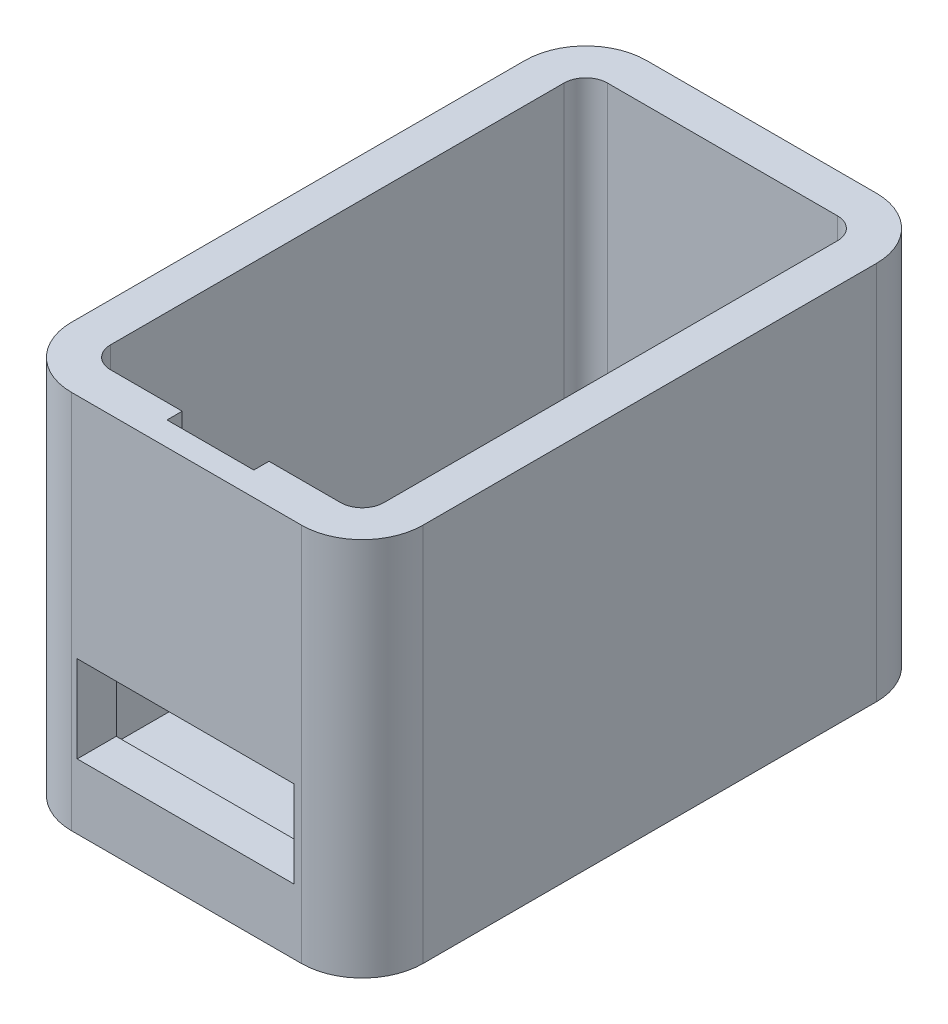
ISO-10303-21;
HEADER;
FILE_DESCRIPTION(('STEP AP214'),'2;1');
FILE_NAME('part.step','',(''),(''),'','','');
FILE_SCHEMA(('AUTOMOTIVE_DESIGN { 1 0 10303 214 1 1 1 1 }'));
ENDSEC;
DATA;
#1=APPLICATION_CONTEXT('core data for automotive mechanical design processes');
#2=APPLICATION_PROTOCOL_DEFINITION('international standard','automotive_design',2000,#1);
#3=PRODUCT_CONTEXT('',#1,'mechanical');
#4=PRODUCT('Part','Part','',(#3));
#5=PRODUCT_RELATED_PRODUCT_CATEGORY('part','',(#4));
#6=PRODUCT_DEFINITION_FORMATION('','',#4);
#7=PRODUCT_DEFINITION_CONTEXT('part definition',#1,'design');
#8=PRODUCT_DEFINITION('design','',#6,#7);
#9=PRODUCT_DEFINITION_SHAPE('','',#8);
#10=(LENGTH_UNIT() NAMED_UNIT(*) SI_UNIT(.MILLI.,.METRE.));
#11=(NAMED_UNIT(*) PLANE_ANGLE_UNIT() SI_UNIT($,.RADIAN.));
#12=(NAMED_UNIT(*) SI_UNIT($,.STERADIAN.) SOLID_ANGLE_UNIT());
#13=UNCERTAINTY_MEASURE_WITH_UNIT(LENGTH_MEASURE(1.E-05),#10,'distance_accuracy_value','');
#14=(GEOMETRIC_REPRESENTATION_CONTEXT(3) GLOBAL_UNCERTAINTY_ASSIGNED_CONTEXT((#13)) GLOBAL_UNIT_ASSIGNED_CONTEXT((#10,
#11,#12)) REPRESENTATION_CONTEXT('',''));
#15=CARTESIAN_POINT('',(0.,0.,0.));
#16=DIRECTION('',(0.,0.,1.));
#17=DIRECTION('',(1.,0.,0.));
#18=AXIS2_PLACEMENT_3D('',#15,#16,#17);
#19=CARTESIAN_POINT('',(-5.25,16.,-10.5));
#20=DIRECTION('',(0.,1.,0.));
#21=DIRECTION('',(0.,0.,1.));
#22=AXIS2_PLACEMENT_3D('',#19,#20,#21);
#23=PLANE('',#22);
#24=DIRECTION('',(0.,0.,-1.));
#25=VECTOR('',#24,1.);
#26=CARTESIAN_POINT('',(2.05,16.,10.7));
#27=LINE('',#26,#25);
#28=CARTESIAN_POINT('',(2.05,16.,12.1));
#29=VERTEX_POINT('',#28);
#30=CARTESIAN_POINT('',(2.05,16.,11.4));
#31=VERTEX_POINT('',#30);
#32=EDGE_CURVE('E217',#29,#31,#27,.T.);
#33=ORIENTED_EDGE('',*,*,#32,.F.);
#34=DIRECTION('',(1.,0.,0.));
#35=VECTOR('',#34,1.);
#36=CARTESIAN_POINT('',(-1.95,16.,12.1));
#37=LINE('',#36,#35);
#38=CARTESIAN_POINT('',(-1.95,16.,12.1));
#39=VERTEX_POINT('',#38);
#40=EDGE_CURVE('E203',#39,#29,#37,.T.);
#41=ORIENTED_EDGE('',*,*,#40,.F.);
#42=DIRECTION('',(0.,0.,1.));
#43=VECTOR('',#42,1.);
#44=CARTESIAN_POINT('',(-1.95,16.,10.7));
#45=LINE('',#44,#43);
#46=CARTESIAN_POINT('',(-1.95,16.,11.4));
#47=VERTEX_POINT('',#46);
#48=EDGE_CURVE('E210',#47,#39,#45,.T.);
#49=ORIENTED_EDGE('',*,*,#48,.F.);
#50=DIRECTION('',(1.,0.,0.));
#51=VECTOR('',#50,1.);
#52=CARTESIAN_POINT('',(-5.24999999999999,16.,11.4));
#53=LINE('',#52,#51);
#54=CARTESIAN_POINT('',(-5.24999999999999,16.,11.4));
#55=VERTEX_POINT('',#54);
#56=EDGE_CURVE('E275',#55,#47,#53,.T.);
#57=ORIENTED_EDGE('',*,*,#56,.F.);
#58=CARTESIAN_POINT('',(-5.25,16.,10.4));
#59=DIRECTION('',(0.,1.,0.));
#60=DIRECTION('',(0.,0.,1.));
#61=AXIS2_PLACEMENT_3D('',#58,#59,#60);
#62=CIRCLE('',#61,1.);
#63=CARTESIAN_POINT('',(-6.25,16.,10.4));
#64=VERTEX_POINT('',#63);
#65=EDGE_CURVE('E271',#64,#55,#62,.T.);
#66=ORIENTED_EDGE('',*,*,#65,.F.);
#67=DIRECTION('',(0.,0.,1.));
#68=VECTOR('',#67,1.);
#69=CARTESIAN_POINT('',(-6.25,16.,-10.5));
#70=LINE('',#69,#68);
#71=CARTESIAN_POINT('',(-6.25,16.,-10.5));
#72=VERTEX_POINT('',#71);
#73=EDGE_CURVE('E288',#72,#64,#70,.T.);
#74=ORIENTED_EDGE('',*,*,#73,.F.);
#75=CARTESIAN_POINT('',(-5.25,16.,-10.5));
#76=DIRECTION('',(0.,1.,0.));
#77=DIRECTION('',(0.,0.,1.));
#78=AXIS2_PLACEMENT_3D('',#75,#76,#77);
#79=CIRCLE('',#78,1.);
#80=CARTESIAN_POINT('',(-5.25,16.,-11.5));
#81=VERTEX_POINT('',#80);
#82=EDGE_CURVE('E285',#81,#72,#79,.T.);
#83=ORIENTED_EDGE('',*,*,#82,.F.);
#84=DIRECTION('',(-1.,0.,0.));
#85=VECTOR('',#84,1.);
#86=CARTESIAN_POINT('',(-5.25,16.,-11.5));
#87=LINE('',#86,#85);
#88=CARTESIAN_POINT('',(5.35,16.,-11.5));
#89=VERTEX_POINT('',#88);
#90=EDGE_CURVE('E283',#89,#81,#87,.T.);
#91=ORIENTED_EDGE('',*,*,#90,.F.);
#92=CARTESIAN_POINT('',(5.35,16.,-10.5));
#93=DIRECTION('',(0.,1.,0.));
#94=DIRECTION('',(0.,0.,-1.));
#95=AXIS2_PLACEMENT_3D('',#92,#93,#94);
#96=CIRCLE('',#95,1.);
#97=CARTESIAN_POINT('',(6.35,16.,-10.5));
#98=VERTEX_POINT('',#97);
#99=EDGE_CURVE('E281',#98,#89,#96,.T.);
#100=ORIENTED_EDGE('',*,*,#99,.F.);
#101=DIRECTION('',(0.,0.,-1.));
#102=VECTOR('',#101,1.);
#103=CARTESIAN_POINT('',(6.35,16.,-10.5));
#104=LINE('',#103,#102);
#105=CARTESIAN_POINT('',(6.35,16.,10.4));
#106=VERTEX_POINT('',#105);
#107=EDGE_CURVE('E279',#106,#98,#104,.T.);
#108=ORIENTED_EDGE('',*,*,#107,.F.);
#109=CARTESIAN_POINT('',(5.35,16.,10.4));
#110=DIRECTION('',(0.,1.,0.));
#111=DIRECTION('',(0.,0.,1.));
#112=AXIS2_PLACEMENT_3D('',#109,#110,#111);
#113=CIRCLE('',#112,1.);
#114=CARTESIAN_POINT('',(5.35,16.,11.4));
#115=VERTEX_POINT('',#114);
#116=EDGE_CURVE('E277',#115,#106,#113,.T.);
#117=ORIENTED_EDGE('',*,*,#116,.F.);
#118=EDGE_CURVE('E273',#31,#115,#53,.T.);
#119=ORIENTED_EDGE('',*,*,#118,.F.);
#120=EDGE_LOOP('',(#33,#41,#49,#57,#66,#74,#83,#91,#100,#108,#117,#119));
#121=FACE_BOUND('',#120,.T.);
#122=CARTESIAN_POINT('',(-5.25,16.,-10.5));
#123=DIRECTION('',(0.,1.,0.));
#124=DIRECTION('',(0.,0.,1.));
#125=AXIS2_PLACEMENT_3D('',#122,#123,#124);
#126=CIRCLE('',#125,2.8);
#127=CARTESIAN_POINT('',(-5.25,16.,-13.3));
#128=VERTEX_POINT('',#127);
#129=CARTESIAN_POINT('',(-8.05,16.,-10.5));
#130=VERTEX_POINT('',#129);
#131=EDGE_CURVE('E329',#128,#130,#126,.T.);
#132=ORIENTED_EDGE('',*,*,#131,.T.);
#133=DIRECTION('',(0.,0.,1.));
#134=VECTOR('',#133,1.);
#135=CARTESIAN_POINT('',(-8.05,16.,-10.5));
#136=LINE('',#135,#134);
#137=CARTESIAN_POINT('',(-8.05,16.,10.4));
#138=VERTEX_POINT('',#137);
#139=EDGE_CURVE('E332',#130,#138,#136,.T.);
#140=ORIENTED_EDGE('',*,*,#139,.T.);
#141=CARTESIAN_POINT('',(-5.25,16.,10.4));
#142=DIRECTION('',(0.,1.,0.));
#143=DIRECTION('',(0.,0.,1.));
#144=AXIS2_PLACEMENT_3D('',#141,#142,#143);
#145=CIRCLE('',#144,2.8);
#146=CARTESIAN_POINT('',(-5.24999999999999,16.,13.2));
#147=VERTEX_POINT('',#146);
#148=EDGE_CURVE('E334',#138,#147,#145,.T.);
#149=ORIENTED_EDGE('',*,*,#148,.T.);
#150=DIRECTION('',(1.,0.,0.));
#151=VECTOR('',#150,1.);
#152=CARTESIAN_POINT('',(-5.24999999999999,16.,13.2));
#153=LINE('',#152,#151);
#154=CARTESIAN_POINT('',(5.35,16.,13.2));
#155=VERTEX_POINT('',#154);
#156=EDGE_CURVE('E336',#147,#155,#153,.T.);
#157=ORIENTED_EDGE('',*,*,#156,.T.);
#158=CARTESIAN_POINT('',(5.35,16.,10.4));
#159=DIRECTION('',(0.,1.,0.));
#160=DIRECTION('',(0.,0.,1.));
#161=AXIS2_PLACEMENT_3D('',#158,#159,#160);
#162=CIRCLE('',#161,2.8);
#163=CARTESIAN_POINT('',(8.15,16.,10.4));
#164=VERTEX_POINT('',#163);
#165=EDGE_CURVE('E338',#155,#164,#162,.T.);
#166=ORIENTED_EDGE('',*,*,#165,.T.);
#167=DIRECTION('',(0.,0.,-1.));
#168=VECTOR('',#167,1.);
#169=CARTESIAN_POINT('',(8.15,16.,-10.5));
#170=LINE('',#169,#168);
#171=CARTESIAN_POINT('',(8.15,16.,-10.5));
#172=VERTEX_POINT('',#171);
#173=EDGE_CURVE('E340',#164,#172,#170,.T.);
#174=ORIENTED_EDGE('',*,*,#173,.T.);
#175=CARTESIAN_POINT('',(5.35,16.,-10.5));
#176=DIRECTION('',(0.,1.,0.));
#177=DIRECTION('',(0.,0.,-1.));
#178=AXIS2_PLACEMENT_3D('',#175,#176,#177);
#179=CIRCLE('',#178,2.8);
#180=CARTESIAN_POINT('',(5.35,16.,-13.3));
#181=VERTEX_POINT('',#180);
#182=EDGE_CURVE('E342',#172,#181,#179,.T.);
#183=ORIENTED_EDGE('',*,*,#182,.T.);
#184=DIRECTION('',(-1.,0.,0.));
#185=VECTOR('',#184,1.);
#186=CARTESIAN_POINT('',(-5.25,16.,-13.3));
#187=LINE('',#186,#185);
#188=EDGE_CURVE('E344',#181,#128,#187,.T.);
#189=ORIENTED_EDGE('',*,*,#188,.T.);
#190=EDGE_LOOP('',(#132,#140,#149,#157,#166,#174,#183,#189));
#191=FACE_BOUND('',#190,.T.);
#192=ADVANCED_FACE('F39',(#121,#191),#23,.T.);
#193=CARTESIAN_POINT('',(-5.25,16.,-10.5));
#194=DIRECTION('',(0.,-1.,0.));
#195=DIRECTION('',(0.,0.,-1.));
#196=AXIS2_PLACEMENT_3D('',#193,#194,#195);
#197=CYLINDRICAL_SURFACE('',#196,2.8);
#198=DIRECTION('',(0.,-1.,0.));
#199=VECTOR('',#198,1.);
#200=CARTESIAN_POINT('',(-5.25,16.,-13.3));
#201=LINE('',#200,#199);
#202=CARTESIAN_POINT('',(-5.25,-1.5,-13.3));
#203=VERTEX_POINT('',#202);
#204=EDGE_CURVE('E346',#128,#203,#201,.T.);
#205=ORIENTED_EDGE('',*,*,#204,.T.);
#206=CARTESIAN_POINT('',(-5.25,-1.5,-10.5));
#207=DIRECTION('',(0.,-1.,0.));
#208=DIRECTION('',(0.,0.,-1.));
#209=AXIS2_PLACEMENT_3D('',#206,#207,#208);
#210=CIRCLE('',#209,2.8);
#211=CARTESIAN_POINT('',(-8.05,-1.5,-10.5));
#212=VERTEX_POINT('',#211);
#213=EDGE_CURVE('E258',#212,#203,#210,.T.);
#214=ORIENTED_EDGE('',*,*,#213,.F.);
#215=DIRECTION('',(0.,-1.,0.));
#216=VECTOR('',#215,1.);
#217=CARTESIAN_POINT('',(-8.05,16.,-10.5));
#218=LINE('',#217,#216);
#219=EDGE_CURVE('E360',#130,#212,#218,.T.);
#220=ORIENTED_EDGE('',*,*,#219,.F.);
#221=ORIENTED_EDGE('',*,*,#131,.F.);
#222=EDGE_LOOP('',(#205,#214,#220,#221));
#223=FACE_BOUND('',#222,.T.);
#224=ADVANCED_FACE('F41',(#223),#197,.T.);
#225=CARTESIAN_POINT('',(-8.05,16.,-10.5));
#226=DIRECTION('',(1.,0.,0.));
#227=DIRECTION('',(0.,0.,-1.));
#228=AXIS2_PLACEMENT_3D('',#225,#226,#227);
#229=PLANE('',#228);
#230=ORIENTED_EDGE('',*,*,#219,.T.);
#231=DIRECTION('',(0.,0.,-1.));
#232=VECTOR('',#231,1.);
#233=CARTESIAN_POINT('',(-8.05,-1.5,-10.5));
#234=LINE('',#233,#232);
#235=CARTESIAN_POINT('',(-8.05,-1.5,10.4));
#236=VERTEX_POINT('',#235);
#237=EDGE_CURVE('E255',#236,#212,#234,.T.);
#238=ORIENTED_EDGE('',*,*,#237,.F.);
#239=DIRECTION('',(0.,-1.,0.));
#240=VECTOR('',#239,1.);
#241=CARTESIAN_POINT('',(-8.05,16.,10.4));
#242=LINE('',#241,#240);
#243=EDGE_CURVE('E358',#138,#236,#242,.T.);
#244=ORIENTED_EDGE('',*,*,#243,.F.);
#245=ORIENTED_EDGE('',*,*,#139,.F.);
#246=EDGE_LOOP('',(#230,#238,#244,#245));
#247=FACE_BOUND('',#246,.T.);
#248=ADVANCED_FACE('F438',(#247),#229,.F.);
#249=CARTESIAN_POINT('',(-5.25,16.,10.4));
#250=DIRECTION('',(0.,-1.,0.));
#251=DIRECTION('',(0.,0.,-1.));
#252=AXIS2_PLACEMENT_3D('',#249,#250,#251);
#253=CYLINDRICAL_SURFACE('',#252,2.8);
#254=ORIENTED_EDGE('',*,*,#243,.T.);
#255=CARTESIAN_POINT('',(-5.25,-1.5,10.4));
#256=DIRECTION('',(0.,-1.,0.));
#257=DIRECTION('',(0.,0.,-1.));
#258=AXIS2_PLACEMENT_3D('',#255,#256,#257);
#259=CIRCLE('',#258,2.8);
#260=CARTESIAN_POINT('',(-5.24999999999999,-1.5,13.2));
#261=VERTEX_POINT('',#260);
#262=EDGE_CURVE('E252',#261,#236,#259,.T.);
#263=ORIENTED_EDGE('',*,*,#262,.F.);
#264=DIRECTION('',(0.,-1.,0.));
#265=VECTOR('',#264,1.);
#266=CARTESIAN_POINT('',(-5.24999999999999,16.,13.2));
#267=LINE('',#266,#265);
#268=EDGE_CURVE('E356',#147,#261,#267,.T.);
#269=ORIENTED_EDGE('',*,*,#268,.F.);
#270=ORIENTED_EDGE('',*,*,#148,.F.);
#271=EDGE_LOOP('',(#254,#263,#269,#270));
#272=FACE_BOUND('',#271,.T.);
#273=ADVANCED_FACE('F462',(#272),#253,.T.);
#274=CARTESIAN_POINT('',(-5.24999999999999,16.,13.2));
#275=DIRECTION('',(0.,0.,-1.));
#276=DIRECTION('',(-1.,0.,0.));
#277=AXIS2_PLACEMENT_3D('',#274,#275,#276);
#278=PLANE('',#277);
#279=DIRECTION('',(1.,0.,0.));
#280=VECTOR('',#279,1.);
#281=CARTESIAN_POINT('',(-4.9890625,1.5,13.2));
#282=LINE('',#281,#280);
#283=CARTESIAN_POINT('',(-4.9890625,1.5,13.2));
#284=VERTEX_POINT('',#283);
#285=CARTESIAN_POINT('',(5.0109375,1.5,13.2));
#286=VERTEX_POINT('',#285);
#287=EDGE_CURVE('E229',#284,#286,#282,.T.);
#288=ORIENTED_EDGE('',*,*,#287,.F.);
#289=DIRECTION('',(0.,-1.,0.));
#290=VECTOR('',#289,1.);
#291=CARTESIAN_POINT('',(-4.9890625,5.5,13.2));
#292=LINE('',#291,#290);
#293=CARTESIAN_POINT('',(-4.9890625,5.5,13.2));
#294=VERTEX_POINT('',#293);
#295=EDGE_CURVE('E62',#294,#284,#292,.T.);
#296=ORIENTED_EDGE('',*,*,#295,.F.);
#297=DIRECTION('',(-1.,0.,0.));
#298=VECTOR('',#297,1.);
#299=CARTESIAN_POINT('',(-4.9890625,5.5,13.2));
#300=LINE('',#299,#298);
#301=CARTESIAN_POINT('',(5.0109375,5.5,13.2));
#302=VERTEX_POINT('',#301);
#303=EDGE_CURVE('E235',#302,#294,#300,.T.);
#304=ORIENTED_EDGE('',*,*,#303,.F.);
#305=DIRECTION('',(0.,1.,0.));
#306=VECTOR('',#305,1.);
#307=CARTESIAN_POINT('',(5.0109375,5.5,13.2));
#308=LINE('',#307,#306);
#309=EDGE_CURVE('E232',#286,#302,#308,.T.);
#310=ORIENTED_EDGE('',*,*,#309,.F.);
#311=EDGE_LOOP('',(#288,#296,#304,#310));
#312=FACE_BOUND('',#311,.T.);
#313=ORIENTED_EDGE('',*,*,#268,.T.);
#314=DIRECTION('',(-1.,0.,0.));
#315=VECTOR('',#314,1.);
#316=CARTESIAN_POINT('',(-5.24999999999999,-1.5,13.2));
#317=LINE('',#316,#315);
#318=CARTESIAN_POINT('',(5.35,-1.5,13.2));
#319=VERTEX_POINT('',#318);
#320=EDGE_CURVE('E249',#319,#261,#317,.T.);
#321=ORIENTED_EDGE('',*,*,#320,.F.);
#322=DIRECTION('',(0.,-1.,0.));
#323=VECTOR('',#322,1.);
#324=CARTESIAN_POINT('',(5.35,16.,13.2));
#325=LINE('',#324,#323);
#326=EDGE_CURVE('E354',#155,#319,#325,.T.);
#327=ORIENTED_EDGE('',*,*,#326,.F.);
#328=ORIENTED_EDGE('',*,*,#156,.F.);
#329=EDGE_LOOP('',(#313,#321,#327,#328));
#330=FACE_BOUND('',#329,.T.);
#331=ADVANCED_FACE('F458',(#312,#330),#278,.F.);
#332=CARTESIAN_POINT('',(5.35,16.,10.4));
#333=DIRECTION('',(0.,-1.,0.));
#334=DIRECTION('',(0.,0.,-1.));
#335=AXIS2_PLACEMENT_3D('',#332,#333,#334);
#336=CYLINDRICAL_SURFACE('',#335,2.8);
#337=ORIENTED_EDGE('',*,*,#326,.T.);
#338=CARTESIAN_POINT('',(5.35,-1.5,10.4));
#339=DIRECTION('',(0.,-1.,0.));
#340=DIRECTION('',(0.,0.,-1.));
#341=AXIS2_PLACEMENT_3D('',#338,#339,#340);
#342=CIRCLE('',#341,2.8);
#343=CARTESIAN_POINT('',(8.15,-1.5,10.4));
#344=VERTEX_POINT('',#343);
#345=EDGE_CURVE('E241',#344,#319,#342,.T.);
#346=ORIENTED_EDGE('',*,*,#345,.F.);
#347=DIRECTION('',(0.,-1.,0.));
#348=VECTOR('',#347,1.);
#349=CARTESIAN_POINT('',(8.15,16.,10.4));
#350=LINE('',#349,#348);
#351=EDGE_CURVE('E352',#164,#344,#350,.T.);
#352=ORIENTED_EDGE('',*,*,#351,.F.);
#353=ORIENTED_EDGE('',*,*,#165,.F.);
#354=EDGE_LOOP('',(#337,#346,#352,#353));
#355=FACE_BOUND('',#354,.T.);
#356=ADVANCED_FACE('F454',(#355),#336,.T.);
#357=CARTESIAN_POINT('',(8.15,16.,-10.5));
#358=DIRECTION('',(-1.,0.,0.));
#359=DIRECTION('',(0.,0.,1.));
#360=AXIS2_PLACEMENT_3D('',#357,#358,#359);
#361=PLANE('',#360);
#362=ORIENTED_EDGE('',*,*,#351,.T.);
#363=DIRECTION('',(0.,0.,1.));
#364=VECTOR('',#363,1.);
#365=CARTESIAN_POINT('',(8.15,-1.5,10.4));
#366=LINE('',#365,#364);
#367=CARTESIAN_POINT('',(8.15,-1.5,-10.5));
#368=VERTEX_POINT('',#367);
#369=EDGE_CURVE('E267',#368,#344,#366,.T.);
#370=ORIENTED_EDGE('',*,*,#369,.F.);
#371=DIRECTION('',(0.,-1.,0.));
#372=VECTOR('',#371,1.);
#373=CARTESIAN_POINT('',(8.15,16.,-10.5));
#374=LINE('',#373,#372);
#375=EDGE_CURVE('E350',#172,#368,#374,.T.);
#376=ORIENTED_EDGE('',*,*,#375,.F.);
#377=ORIENTED_EDGE('',*,*,#173,.F.);
#378=EDGE_LOOP('',(#362,#370,#376,#377));
#379=FACE_BOUND('',#378,.T.);
#380=ADVANCED_FACE('F450',(#379),#361,.F.);
#381=CARTESIAN_POINT('',(5.35,16.,-10.5));
#382=DIRECTION('',(0.,-1.,0.));
#383=DIRECTION('',(0.,0.,-1.));
#384=AXIS2_PLACEMENT_3D('',#381,#382,#383);
#385=CYLINDRICAL_SURFACE('',#384,2.8);
#386=ORIENTED_EDGE('',*,*,#375,.T.);
#387=CARTESIAN_POINT('',(5.35,-1.5,-10.5));
#388=DIRECTION('',(0.,-1.,0.));
#389=DIRECTION('',(0.,0.,-1.));
#390=AXIS2_PLACEMENT_3D('',#387,#388,#389);
#391=CIRCLE('',#390,2.8);
#392=CARTESIAN_POINT('',(5.35,-1.5,-13.3));
#393=VERTEX_POINT('',#392);
#394=EDGE_CURVE('E264',#393,#368,#391,.T.);
#395=ORIENTED_EDGE('',*,*,#394,.F.);
#396=DIRECTION('',(0.,-1.,0.));
#397=VECTOR('',#396,1.);
#398=CARTESIAN_POINT('',(5.35,16.,-13.3));
#399=LINE('',#398,#397);
#400=EDGE_CURVE('E348',#181,#393,#399,.T.);
#401=ORIENTED_EDGE('',*,*,#400,.F.);
#402=ORIENTED_EDGE('',*,*,#182,.F.);
#403=EDGE_LOOP('',(#386,#395,#401,#402));
#404=FACE_BOUND('',#403,.T.);
#405=ADVANCED_FACE('F446',(#404),#385,.T.);
#406=CARTESIAN_POINT('',(-5.25,16.,-13.3));
#407=DIRECTION('',(0.,0.,1.));
#408=DIRECTION('',(1.,0.,0.));
#409=AXIS2_PLACEMENT_3D('',#406,#407,#408);
#410=PLANE('',#409);
#411=ORIENTED_EDGE('',*,*,#400,.T.);
#412=DIRECTION('',(1.,0.,0.));
#413=VECTOR('',#412,1.);
#414=CARTESIAN_POINT('',(5.35,-1.5,-13.3));
#415=LINE('',#414,#413);
#416=EDGE_CURVE('E261',#203,#393,#415,.T.);
#417=ORIENTED_EDGE('',*,*,#416,.F.);
#418=ORIENTED_EDGE('',*,*,#204,.F.);
#419=ORIENTED_EDGE('',*,*,#188,.F.);
#420=EDGE_LOOP('',(#411,#417,#418,#419));
#421=FACE_BOUND('',#420,.T.);
#422=ADVANCED_FACE('F443',(#421),#410,.F.);
#423=CARTESIAN_POINT('',(-5.25,16.,10.4));
#424=DIRECTION('',(0.,-1.,0.));
#425=DIRECTION('',(0.,0.,-1.));
#426=AXIS2_PLACEMENT_3D('',#423,#424,#425);
#427=CYLINDRICAL_SURFACE('',#426,1.);
#428=CARTESIAN_POINT('',(-5.25,0.,10.4));
#429=DIRECTION('',(0.,1.,0.));
#430=DIRECTION('',(0.,0.,1.));
#431=AXIS2_PLACEMENT_3D('',#428,#429,#430);
#432=CIRCLE('',#431,1.);
#433=CARTESIAN_POINT('',(-6.25,0.,10.4));
#434=VERTEX_POINT('',#433);
#435=CARTESIAN_POINT('',(-5.24999999999999,0.,11.4));
#436=VERTEX_POINT('',#435);
#437=EDGE_CURVE('E270',#434,#436,#432,.T.);
#438=ORIENTED_EDGE('',*,*,#437,.F.);
#439=DIRECTION('',(0.,-1.,0.));
#440=VECTOR('',#439,1.);
#441=CARTESIAN_POINT('',(-6.25,16.,10.4));
#442=LINE('',#441,#440);
#443=EDGE_CURVE('E290',#64,#434,#442,.T.);
#444=ORIENTED_EDGE('',*,*,#443,.F.);
#445=ORIENTED_EDGE('',*,*,#65,.T.);
#446=DIRECTION('',(0.,-1.,0.));
#447=VECTOR('',#446,1.);
#448=CARTESIAN_POINT('',(-5.24999999999999,16.,11.4));
#449=LINE('',#448,#447);
#450=EDGE_CURVE('E326',#55,#436,#449,.T.);
#451=ORIENTED_EDGE('',*,*,#450,.T.);
#452=EDGE_LOOP('',(#438,#444,#445,#451));
#453=FACE_BOUND('',#452,.T.);
#454=ADVANCED_FACE('F390',(#453),#427,.F.);
#455=CARTESIAN_POINT('',(-5.24999999999999,16.,11.4));
#456=DIRECTION('',(0.,0.,-1.));
#457=DIRECTION('',(-1.,0.,0.));
#458=AXIS2_PLACEMENT_3D('',#455,#456,#457);
#459=PLANE('',#458);
#460=DIRECTION('',(0.,-1.,0.));
#461=VECTOR('',#460,1.);
#462=CARTESIAN_POINT('',(2.05,16.,11.4));
#463=LINE('',#462,#461);
#464=CARTESIAN_POINT('',(2.05,5.5,11.4));
#465=VERTEX_POINT('',#464);
#466=EDGE_CURVE('E226',#31,#465,#463,.T.);
#467=ORIENTED_EDGE('',*,*,#466,.F.);
#468=ORIENTED_EDGE('',*,*,#118,.T.);
#469=DIRECTION('',(0.,-1.,0.));
#470=VECTOR('',#469,1.);
#471=CARTESIAN_POINT('',(5.35,16.,11.4));
#472=LINE('',#471,#470);
#473=CARTESIAN_POINT('',(5.35,0.,11.4));
#474=VERTEX_POINT('',#473);
#475=EDGE_CURVE('E324',#115,#474,#472,.T.);
#476=ORIENTED_EDGE('',*,*,#475,.T.);
#477=DIRECTION('',(1.,0.,0.));
#478=VECTOR('',#477,1.);
#479=CARTESIAN_POINT('',(-5.24999999999999,0.,11.4));
#480=LINE('',#479,#478);
#481=EDGE_CURVE('E293',#436,#474,#480,.T.);
#482=ORIENTED_EDGE('',*,*,#481,.F.);
#483=ORIENTED_EDGE('',*,*,#450,.F.);
#484=ORIENTED_EDGE('',*,*,#56,.T.);
#485=DIRECTION('',(0.,1.,0.));
#486=VECTOR('',#485,1.);
#487=CARTESIAN_POINT('',(-1.95,16.,11.4));
#488=LINE('',#487,#486);
#489=CARTESIAN_POINT('',(-1.95,5.5,11.4));
#490=VERTEX_POINT('',#489);
#491=EDGE_CURVE('E213',#490,#47,#488,.T.);
#492=ORIENTED_EDGE('',*,*,#491,.F.);
#493=DIRECTION('',(1.,0.,0.));
#494=VECTOR('',#493,1.);
#495=CARTESIAN_POINT('',(-5.24999999999999,5.5,11.4));
#496=LINE('',#495,#494);
#497=CARTESIAN_POINT('',(-4.9890625,5.5,11.4));
#498=VERTEX_POINT('',#497);
#499=EDGE_CURVE('E368',#498,#490,#496,.T.);
#500=ORIENTED_EDGE('',*,*,#499,.F.);
#501=DIRECTION('',(0.,1.,0.));
#502=VECTOR('',#501,1.);
#503=CARTESIAN_POINT('',(-4.9890625,16.,11.4));
#504=LINE('',#503,#502);
#505=CARTESIAN_POINT('',(-4.9890625,1.5,11.4));
#506=VERTEX_POINT('',#505);
#507=EDGE_CURVE('E371',#506,#498,#504,.T.);
#508=ORIENTED_EDGE('',*,*,#507,.F.);
#509=DIRECTION('',(-1.,0.,0.));
#510=VECTOR('',#509,1.);
#511=CARTESIAN_POINT('',(-5.24999999999999,1.5,11.4));
#512=LINE('',#511,#510);
#513=CARTESIAN_POINT('',(5.0109375,1.5,11.4));
#514=VERTEX_POINT('',#513);
#515=EDGE_CURVE('E362',#514,#506,#512,.T.);
#516=ORIENTED_EDGE('',*,*,#515,.F.);
#517=DIRECTION('',(0.,-1.,0.));
#518=VECTOR('',#517,1.);
#519=CARTESIAN_POINT('',(5.0109375,16.,11.4));
#520=LINE('',#519,#518);
#521=CARTESIAN_POINT('',(5.0109375,5.5,11.4));
#522=VERTEX_POINT('',#521);
#523=EDGE_CURVE('E364',#522,#514,#520,.T.);
#524=ORIENTED_EDGE('',*,*,#523,.F.);
#525=EDGE_CURVE('E367',#465,#522,#496,.T.);
#526=ORIENTED_EDGE('',*,*,#525,.F.);
#527=EDGE_LOOP('',(#467,#468,#476,#482,#483,#484,#492,#500,#508,#516,#524,#526));
#528=FACE_BOUND('',#527,.T.);
#529=ADVANCED_FACE('F381',(#528),#459,.T.);
#530=CARTESIAN_POINT('',(5.35,16.,10.4));
#531=DIRECTION('',(0.,-1.,0.));
#532=DIRECTION('',(0.,0.,-1.));
#533=AXIS2_PLACEMENT_3D('',#530,#531,#532);
#534=CYLINDRICAL_SURFACE('',#533,1.);
#535=CARTESIAN_POINT('',(5.35,0.,10.4));
#536=DIRECTION('',(0.,1.,0.));
#537=DIRECTION('',(0.,0.,1.));
#538=AXIS2_PLACEMENT_3D('',#535,#536,#537);
#539=CIRCLE('',#538,1.);
#540=CARTESIAN_POINT('',(6.35,0.,10.4));
#541=VERTEX_POINT('',#540);
#542=EDGE_CURVE('E296',#474,#541,#539,.T.);
#543=ORIENTED_EDGE('',*,*,#542,.F.);
#544=ORIENTED_EDGE('',*,*,#475,.F.);
#545=ORIENTED_EDGE('',*,*,#116,.T.);
#546=DIRECTION('',(0.,-1.,0.));
#547=VECTOR('',#546,1.);
#548=CARTESIAN_POINT('',(6.35,16.,10.4));
#549=LINE('',#548,#547);
#550=EDGE_CURVE('E322',#106,#541,#549,.T.);
#551=ORIENTED_EDGE('',*,*,#550,.T.);
#552=EDGE_LOOP('',(#543,#544,#545,#551));
#553=FACE_BOUND('',#552,.T.);
#554=ADVANCED_FACE('F417',(#553),#534,.F.);
#555=CARTESIAN_POINT('',(6.35,16.,-10.5));
#556=DIRECTION('',(-1.,0.,0.));
#557=DIRECTION('',(0.,0.,1.));
#558=AXIS2_PLACEMENT_3D('',#555,#556,#557);
#559=PLANE('',#558);
#560=DIRECTION('',(0.,0.,-1.));
#561=VECTOR('',#560,1.);
#562=CARTESIAN_POINT('',(6.35,0.,-10.5));
#563=LINE('',#562,#561);
#564=CARTESIAN_POINT('',(6.35,0.,-10.5));
#565=VERTEX_POINT('',#564);
#566=EDGE_CURVE('E299',#541,#565,#563,.T.);
#567=ORIENTED_EDGE('',*,*,#566,.F.);
#568=ORIENTED_EDGE('',*,*,#550,.F.);
#569=ORIENTED_EDGE('',*,*,#107,.T.);
#570=DIRECTION('',(0.,-1.,0.));
#571=VECTOR('',#570,1.);
#572=CARTESIAN_POINT('',(6.35,16.,-10.5));
#573=LINE('',#572,#571);
#574=EDGE_CURVE('E320',#98,#565,#573,.T.);
#575=ORIENTED_EDGE('',*,*,#574,.T.);
#576=EDGE_LOOP('',(#567,#568,#569,#575));
#577=FACE_BOUND('',#576,.T.);
#578=ADVANCED_FACE('F411',(#577),#559,.T.);
#579=CARTESIAN_POINT('',(5.35,16.,-10.5));
#580=DIRECTION('',(0.,-1.,0.));
#581=DIRECTION('',(0.,0.,-1.));
#582=AXIS2_PLACEMENT_3D('',#579,#580,#581);
#583=CYLINDRICAL_SURFACE('',#582,1.);
#584=CARTESIAN_POINT('',(5.35,0.,-10.5));
#585=DIRECTION('',(0.,1.,0.));
#586=DIRECTION('',(0.,0.,-1.));
#587=AXIS2_PLACEMENT_3D('',#584,#585,#586);
#588=CIRCLE('',#587,1.);
#589=CARTESIAN_POINT('',(5.35,0.,-11.5));
#590=VERTEX_POINT('',#589);
#591=EDGE_CURVE('E302',#565,#590,#588,.T.);
#592=ORIENTED_EDGE('',*,*,#591,.F.);
#593=ORIENTED_EDGE('',*,*,#574,.F.);
#594=ORIENTED_EDGE('',*,*,#99,.T.);
#595=DIRECTION('',(0.,-1.,0.));
#596=VECTOR('',#595,1.);
#597=CARTESIAN_POINT('',(5.35,16.,-11.5));
#598=LINE('',#597,#596);
#599=EDGE_CURVE('E318',#89,#590,#598,.T.);
#600=ORIENTED_EDGE('',*,*,#599,.T.);
#601=EDGE_LOOP('',(#592,#593,#594,#600));
#602=FACE_BOUND('',#601,.T.);
#603=ADVANCED_FACE('F407',(#602),#583,.F.);
#604=CARTESIAN_POINT('',(-5.25,16.,-11.5));
#605=DIRECTION('',(0.,0.,1.));
#606=DIRECTION('',(1.,0.,0.));
#607=AXIS2_PLACEMENT_3D('',#604,#605,#606);
#608=PLANE('',#607);
#609=DIRECTION('',(-1.,0.,0.));
#610=VECTOR('',#609,1.);
#611=CARTESIAN_POINT('',(-5.25,0.,-11.5));
#612=LINE('',#611,#610);
#613=CARTESIAN_POINT('',(-5.25,0.,-11.5));
#614=VERTEX_POINT('',#613);
#615=EDGE_CURVE('E305',#590,#614,#612,.T.);
#616=ORIENTED_EDGE('',*,*,#615,.F.);
#617=ORIENTED_EDGE('',*,*,#599,.F.);
#618=ORIENTED_EDGE('',*,*,#90,.T.);
#619=DIRECTION('',(0.,-1.,0.));
#620=VECTOR('',#619,1.);
#621=CARTESIAN_POINT('',(-5.25,16.,-11.5));
#622=LINE('',#621,#620);
#623=EDGE_CURVE('E316',#81,#614,#622,.T.);
#624=ORIENTED_EDGE('',*,*,#623,.T.);
#625=EDGE_LOOP('',(#616,#617,#618,#624));
#626=FACE_BOUND('',#625,.T.);
#627=ADVANCED_FACE('F404',(#626),#608,.T.);
#628=CARTESIAN_POINT('',(-5.25,16.,-10.5));
#629=DIRECTION('',(0.,-1.,0.));
#630=DIRECTION('',(0.,0.,-1.));
#631=AXIS2_PLACEMENT_3D('',#628,#629,#630);
#632=CYLINDRICAL_SURFACE('',#631,1.);
#633=CARTESIAN_POINT('',(-5.25,0.,-10.5));
#634=DIRECTION('',(0.,1.,0.));
#635=DIRECTION('',(0.,0.,1.));
#636=AXIS2_PLACEMENT_3D('',#633,#634,#635);
#637=CIRCLE('',#636,1.);
#638=CARTESIAN_POINT('',(-6.25,0.,-10.5));
#639=VERTEX_POINT('',#638);
#640=EDGE_CURVE('E308',#614,#639,#637,.T.);
#641=ORIENTED_EDGE('',*,*,#640,.F.);
#642=ORIENTED_EDGE('',*,*,#623,.F.);
#643=ORIENTED_EDGE('',*,*,#82,.T.);
#644=DIRECTION('',(0.,-1.,0.));
#645=VECTOR('',#644,1.);
#646=CARTESIAN_POINT('',(-6.25,16.,-10.5));
#647=LINE('',#646,#645);
#648=EDGE_CURVE('E314',#72,#639,#647,.T.);
#649=ORIENTED_EDGE('',*,*,#648,.T.);
#650=EDGE_LOOP('',(#641,#642,#643,#649));
#651=FACE_BOUND('',#650,.T.);
#652=ADVANCED_FACE('F397',(#651),#632,.F.);
#653=CARTESIAN_POINT('',(-6.25,16.,-10.5));
#654=DIRECTION('',(1.,0.,0.));
#655=DIRECTION('',(0.,0.,-1.));
#656=AXIS2_PLACEMENT_3D('',#653,#654,#655);
#657=PLANE('',#656);
#658=DIRECTION('',(0.,0.,1.));
#659=VECTOR('',#658,1.);
#660=CARTESIAN_POINT('',(-6.25,0.,-10.5));
#661=LINE('',#660,#659);
#662=EDGE_CURVE('E274',#639,#434,#661,.T.);
#663=ORIENTED_EDGE('',*,*,#662,.F.);
#664=ORIENTED_EDGE('',*,*,#648,.F.);
#665=ORIENTED_EDGE('',*,*,#73,.T.);
#666=ORIENTED_EDGE('',*,*,#443,.T.);
#667=EDGE_LOOP('',(#663,#664,#665,#666));
#668=FACE_BOUND('',#667,.T.);
#669=ADVANCED_FACE('F393',(#668),#657,.T.);
#670=CARTESIAN_POINT('',(5.35,0.,10.4));
#671=DIRECTION('',(0.,-1.,0.));
#672=DIRECTION('',(0.,0.,-1.));
#673=AXIS2_PLACEMENT_3D('',#670,#671,#672);
#674=PLANE('',#673);
#675=ORIENTED_EDGE('',*,*,#662,.T.);
#676=ORIENTED_EDGE('',*,*,#437,.T.);
#677=ORIENTED_EDGE('',*,*,#481,.T.);
#678=ORIENTED_EDGE('',*,*,#542,.T.);
#679=ORIENTED_EDGE('',*,*,#566,.T.);
#680=ORIENTED_EDGE('',*,*,#591,.T.);
#681=ORIENTED_EDGE('',*,*,#615,.T.);
#682=ORIENTED_EDGE('',*,*,#640,.T.);
#683=EDGE_LOOP('',(#675,#676,#677,#678,#679,#680,#681,#682));
#684=FACE_BOUND('',#683,.T.);
#685=ADVANCED_FACE('F498',(#684),#674,.F.);
#686=CARTESIAN_POINT('',(5.35,-1.5,10.4));
#687=DIRECTION('',(0.,-1.,0.));
#688=DIRECTION('',(0.,0.,-1.));
#689=AXIS2_PLACEMENT_3D('',#686,#687,#688);
#690=PLANE('',#689);
#691=ORIENTED_EDGE('',*,*,#345,.T.);
#692=ORIENTED_EDGE('',*,*,#320,.T.);
#693=ORIENTED_EDGE('',*,*,#262,.T.);
#694=ORIENTED_EDGE('',*,*,#237,.T.);
#695=ORIENTED_EDGE('',*,*,#213,.T.);
#696=ORIENTED_EDGE('',*,*,#416,.T.);
#697=ORIENTED_EDGE('',*,*,#394,.T.);
#698=ORIENTED_EDGE('',*,*,#369,.T.);
#699=EDGE_LOOP('',(#691,#692,#693,#694,#695,#696,#697,#698));
#700=FACE_BOUND('',#699,.T.);
#701=ADVANCED_FACE('F476',(#700),#690,.T.);
#702=CARTESIAN_POINT('',(-4.9890625,5.5,10.7));
#703=DIRECTION('',(-1.,0.,0.));
#704=DIRECTION('',(0.,-1.,0.));
#705=AXIS2_PLACEMENT_3D('',#702,#703,#704);
#706=PLANE('',#705);
#707=ORIENTED_EDGE('',*,*,#507,.T.);
#708=DIRECTION('',(0.,0.,1.));
#709=VECTOR('',#708,1.);
#710=CARTESIAN_POINT('',(-4.9890625,5.5,10.7));
#711=LINE('',#710,#709);
#712=EDGE_CURVE('E239',#498,#294,#711,.T.);
#713=ORIENTED_EDGE('',*,*,#712,.T.);
#714=ORIENTED_EDGE('',*,*,#295,.T.);
#715=DIRECTION('',(0.,0.,1.));
#716=VECTOR('',#715,1.);
#717=CARTESIAN_POINT('',(-4.9890625,1.5,10.7));
#718=LINE('',#717,#716);
#719=EDGE_CURVE('E238',#506,#284,#718,.T.);
#720=ORIENTED_EDGE('',*,*,#719,.F.);
#721=EDGE_LOOP('',(#707,#713,#714,#720));
#722=FACE_BOUND('',#721,.T.);
#723=ADVANCED_FACE('F497',(#722),#706,.F.);
#724=CARTESIAN_POINT('',(-4.9890625,5.5,10.7));
#725=DIRECTION('',(0.,1.,0.));
#726=DIRECTION('',(0.,0.,1.));
#727=AXIS2_PLACEMENT_3D('',#724,#725,#726);
#728=PLANE('',#727);
#729=DIRECTION('',(1.,0.,0.));
#730=VECTOR('',#729,1.);
#731=CARTESIAN_POINT('',(-4.9890625,5.5,12.1));
#732=LINE('',#731,#730);
#733=CARTESIAN_POINT('',(-1.95,5.5,12.1));
#734=VERTEX_POINT('',#733);
#735=CARTESIAN_POINT('',(2.05,5.5,12.1));
#736=VERTEX_POINT('',#735);
#737=EDGE_CURVE('E47',#734,#736,#732,.T.);
#738=ORIENTED_EDGE('',*,*,#737,.T.);
#739=DIRECTION('',(0.,0.,-1.));
#740=VECTOR('',#739,1.);
#741=CARTESIAN_POINT('',(2.05,5.5,10.7));
#742=LINE('',#741,#740);
#743=EDGE_CURVE('E11',#736,#465,#742,.T.);
#744=ORIENTED_EDGE('',*,*,#743,.T.);
#745=ORIENTED_EDGE('',*,*,#525,.T.);
#746=DIRECTION('',(0.,0.,1.));
#747=VECTOR('',#746,1.);
#748=CARTESIAN_POINT('',(5.0109375,5.5,10.7));
#749=LINE('',#748,#747);
#750=EDGE_CURVE('E242',#522,#302,#749,.T.);
#751=ORIENTED_EDGE('',*,*,#750,.T.);
#752=ORIENTED_EDGE('',*,*,#303,.T.);
#753=ORIENTED_EDGE('',*,*,#712,.F.);
#754=ORIENTED_EDGE('',*,*,#499,.T.);
#755=DIRECTION('',(0.,0.,1.));
#756=VECTOR('',#755,1.);
#757=CARTESIAN_POINT('',(-1.95,5.5,10.7));
#758=LINE('',#757,#756);
#759=EDGE_CURVE('E373',#490,#734,#758,.T.);
#760=ORIENTED_EDGE('',*,*,#759,.T.);
#761=EDGE_LOOP('',(#738,#744,#745,#751,#752,#753,#754,#760));
#762=FACE_BOUND('',#761,.T.);
#763=ADVANCED_FACE('F375',(#762),#728,.F.);
#764=CARTESIAN_POINT('',(5.0109375,5.5,10.7));
#765=DIRECTION('',(1.,0.,0.));
#766=DIRECTION('',(0.,1.,0.));
#767=AXIS2_PLACEMENT_3D('',#764,#765,#766);
#768=PLANE('',#767);
#769=ORIENTED_EDGE('',*,*,#523,.T.);
#770=DIRECTION('',(0.,0.,1.));
#771=VECTOR('',#770,1.);
#772=CARTESIAN_POINT('',(5.0109375,1.5,10.7));
#773=LINE('',#772,#771);
#774=EDGE_CURVE('E244',#514,#286,#773,.T.);
#775=ORIENTED_EDGE('',*,*,#774,.T.);
#776=ORIENTED_EDGE('',*,*,#309,.T.);
#777=ORIENTED_EDGE('',*,*,#750,.F.);
#778=EDGE_LOOP('',(#769,#775,#776,#777));
#779=FACE_BOUND('',#778,.T.);
#780=ADVANCED_FACE('F588',(#779),#768,.F.);
#781=CARTESIAN_POINT('',(-4.9890625,1.5,10.7));
#782=DIRECTION('',(0.,-1.,0.));
#783=DIRECTION('',(0.,0.,-1.));
#784=AXIS2_PLACEMENT_3D('',#781,#782,#783);
#785=PLANE('',#784);
#786=ORIENTED_EDGE('',*,*,#515,.T.);
#787=ORIENTED_EDGE('',*,*,#719,.T.);
#788=ORIENTED_EDGE('',*,*,#287,.T.);
#789=ORIENTED_EDGE('',*,*,#774,.F.);
#790=EDGE_LOOP('',(#786,#787,#788,#789));
#791=FACE_BOUND('',#790,.T.);
#792=ADVANCED_FACE('F428',(#791),#785,.F.);
#793=CARTESIAN_POINT('',(-1.95,2.,12.1));
#794=DIRECTION('',(0.,0.,1.));
#795=DIRECTION('',(1.,0.,0.));
#796=AXIS2_PLACEMENT_3D('',#793,#794,#795);
#797=PLANE('',#796);
#798=DIRECTION('',(0.,1.,0.));
#799=VECTOR('',#798,1.);
#800=CARTESIAN_POINT('',(-1.95,2.,12.1));
#801=LINE('',#800,#799);
#802=EDGE_CURVE('E54',#734,#39,#801,.T.);
#803=ORIENTED_EDGE('',*,*,#802,.T.);
#804=ORIENTED_EDGE('',*,*,#40,.T.);
#805=DIRECTION('',(0.,1.,0.));
#806=VECTOR('',#805,1.);
#807=CARTESIAN_POINT('',(2.05,2.,12.1));
#808=LINE('',#807,#806);
#809=EDGE_CURVE('E207',#736,#29,#808,.T.);
#810=ORIENTED_EDGE('',*,*,#809,.F.);
#811=ORIENTED_EDGE('',*,*,#737,.F.);
#812=EDGE_LOOP('',(#803,#804,#810,#811));
#813=FACE_BOUND('',#812,.T.);
#814=ADVANCED_FACE('F200',(#813),#797,.F.);
#815=CARTESIAN_POINT('',(2.05,2.,10.7));
#816=DIRECTION('',(1.,0.,0.));
#817=DIRECTION('',(0.,0.,-1.));
#818=AXIS2_PLACEMENT_3D('',#815,#816,#817);
#819=PLANE('',#818);
#820=ORIENTED_EDGE('',*,*,#466,.T.);
#821=ORIENTED_EDGE('',*,*,#743,.F.);
#822=ORIENTED_EDGE('',*,*,#809,.T.);
#823=ORIENTED_EDGE('',*,*,#32,.T.);
#824=EDGE_LOOP('',(#820,#821,#822,#823));
#825=FACE_BOUND('',#824,.T.);
#826=ADVANCED_FACE('F420',(#825),#819,.F.);
#827=CARTESIAN_POINT('',(-1.95,2.,10.7));
#828=DIRECTION('',(-1.,0.,0.));
#829=DIRECTION('',(0.,0.,1.));
#830=AXIS2_PLACEMENT_3D('',#827,#828,#829);
#831=PLANE('',#830);
#832=ORIENTED_EDGE('',*,*,#491,.T.);
#833=ORIENTED_EDGE('',*,*,#48,.T.);
#834=ORIENTED_EDGE('',*,*,#802,.F.);
#835=ORIENTED_EDGE('',*,*,#759,.F.);
#836=EDGE_LOOP('',(#832,#833,#834,#835));
#837=FACE_BOUND('',#836,.T.);
#838=ADVANCED_FACE('F211',(#837),#831,.F.);
#839=CLOSED_SHELL('',(#192,#224,#248,#273,#331,#356,#380,#405,#422,#454,#529,#554,#578,#603,
#627,#652,#669,#685,#701,#723,#763,#780,#792,#814,#826,#838));
#840=MANIFOLD_SOLID_BREP('B2',#839);
#841=ADVANCED_BREP_SHAPE_REPRESENTATION('',(#18,#840),#14);
#842=SHAPE_DEFINITION_REPRESENTATION(#9,#841);
ENDSEC;
END-ISO-10303-21;
